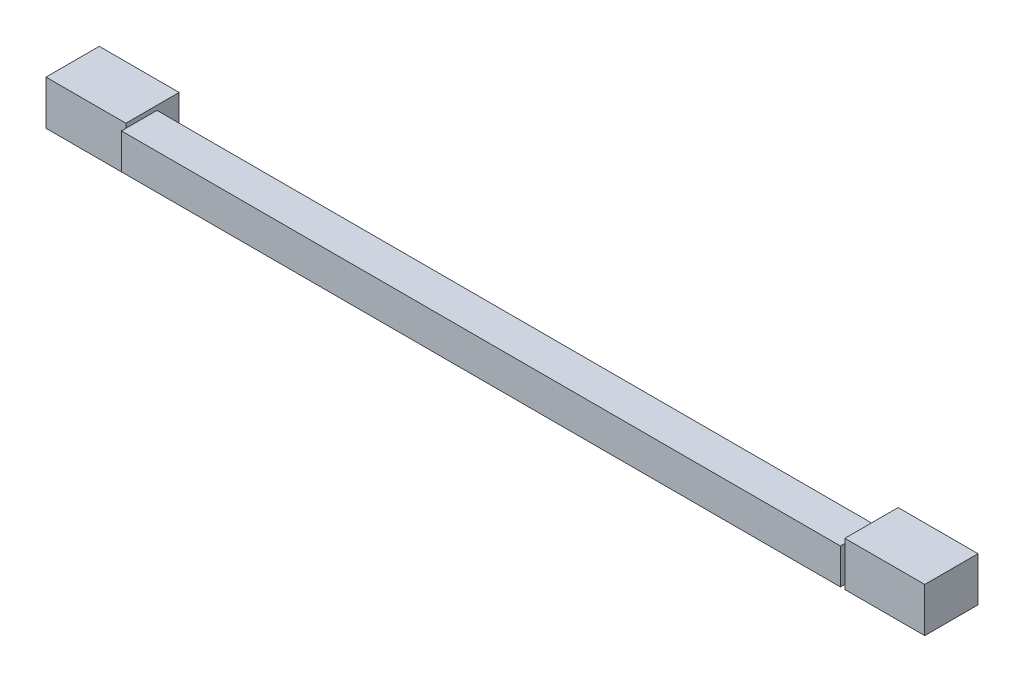
ISO-10303-21;
HEADER;
FILE_DESCRIPTION(('STEP AP214'),'2;1');
FILE_NAME('part.step','',(''),(''),'','','');
FILE_SCHEMA(('AUTOMOTIVE_DESIGN { 1 0 10303 214 1 1 1 1 }'));
ENDSEC;
DATA;
#1=APPLICATION_CONTEXT('core data for automotive mechanical design processes');
#2=APPLICATION_PROTOCOL_DEFINITION('international standard','automotive_design',2000,#1);
#3=PRODUCT_CONTEXT('',#1,'mechanical');
#4=PRODUCT('Part','Part','',(#3));
#5=PRODUCT_RELATED_PRODUCT_CATEGORY('part','',(#4));
#6=PRODUCT_DEFINITION_FORMATION('','',#4);
#7=PRODUCT_DEFINITION_CONTEXT('part definition',#1,'design');
#8=PRODUCT_DEFINITION('design','',#6,#7);
#9=PRODUCT_DEFINITION_SHAPE('','',#8);
#10=(LENGTH_UNIT() NAMED_UNIT(*) SI_UNIT(.MILLI.,.METRE.));
#11=(NAMED_UNIT(*) PLANE_ANGLE_UNIT() SI_UNIT($,.RADIAN.));
#12=(NAMED_UNIT(*) SI_UNIT($,.STERADIAN.) SOLID_ANGLE_UNIT());
#13=UNCERTAINTY_MEASURE_WITH_UNIT(LENGTH_MEASURE(1.E-05),#10,'distance_accuracy_value','');
#14=(GEOMETRIC_REPRESENTATION_CONTEXT(3) GLOBAL_UNCERTAINTY_ASSIGNED_CONTEXT((#13)) GLOBAL_UNIT_ASSIGNED_CONTEXT((#10,
#11,#12)) REPRESENTATION_CONTEXT('',''));
#15=CARTESIAN_POINT('',(0.,0.,0.));
#16=DIRECTION('',(0.,0.,1.));
#17=DIRECTION('',(1.,0.,0.));
#18=AXIS2_PLACEMENT_3D('',#15,#16,#17);
#19=CARTESIAN_POINT('',(0.,0.,13.));
#20=DIRECTION('',(0.,0.,1.));
#21=DIRECTION('',(1.,0.,0.));
#22=AXIS2_PLACEMENT_3D('',#19,#20,#21);
#23=PLANE('',#22);
#24=DIRECTION('',(-1.,0.,0.));
#25=VECTOR('',#24,1.);
#26=CARTESIAN_POINT('',(0.,-4.,13.));
#27=LINE('',#26,#25);
#28=CARTESIAN_POINT('',(81.,-4.,13.));
#29=VERTEX_POINT('',#28);
#30=CARTESIAN_POINT('',(-81.,-4.,13.));
#31=VERTEX_POINT('',#30);
#32=EDGE_CURVE('P0_E10',#29,#31,#27,.T.);
#33=ORIENTED_EDGE('',*,*,#32,.F.);
#34=DIRECTION('',(0.,-1.,0.));
#35=VECTOR('',#34,1.);
#36=CARTESIAN_POINT('',(81.,0.,13.));
#37=LINE('',#36,#35);
#38=CARTESIAN_POINT('',(81.,4.,13.));
#39=VERTEX_POINT('',#38);
#40=EDGE_CURVE('P0_E60',#39,#29,#37,.T.);
#41=ORIENTED_EDGE('',*,*,#40,.F.);
#42=DIRECTION('',(1.,0.,0.));
#43=VECTOR('',#42,1.);
#44=CARTESIAN_POINT('',(0.,4.,13.));
#45=LINE('',#44,#43);
#46=CARTESIAN_POINT('',(-81.,4.,13.));
#47=VERTEX_POINT('',#46);
#48=EDGE_CURVE('P0_E86',#47,#39,#45,.T.);
#49=ORIENTED_EDGE('',*,*,#48,.F.);
#50=DIRECTION('',(0.,1.,0.));
#51=VECTOR('',#50,1.);
#52=CARTESIAN_POINT('',(-81.,0.,13.));
#53=LINE('',#52,#51);
#54=EDGE_CURVE('P0_E23',#31,#47,#53,.T.);
#55=ORIENTED_EDGE('',*,*,#54,.F.);
#56=EDGE_LOOP('',(#33,#41,#49,#55));
#57=FACE_BOUND('',#56,.T.);
#58=ADVANCED_FACE('P0_F16',(#57),#23,.T.);
#59=CARTESIAN_POINT('',(0.,-4.,5.));
#60=DIRECTION('',(0.,-1.,0.));
#61=DIRECTION('',(0.,0.,-1.));
#62=AXIS2_PLACEMENT_3D('',#59,#60,#61);
#63=PLANE('',#62);
#64=DIRECTION('',(0.,0.,1.));
#65=VECTOR('',#64,1.);
#66=CARTESIAN_POINT('',(81.,-4.,5.));
#67=LINE('',#66,#65);
#68=CARTESIAN_POINT('',(81.,-4.,5.));
#69=VERTEX_POINT('',#68);
#70=EDGE_CURVE('P0_E53',#69,#29,#67,.T.);
#71=ORIENTED_EDGE('',*,*,#70,.T.);
#72=ORIENTED_EDGE('',*,*,#32,.T.);
#73=DIRECTION('',(0.,0.,1.));
#74=VECTOR('',#73,1.);
#75=CARTESIAN_POINT('',(-81.,-4.,5.));
#76=LINE('',#75,#74);
#77=CARTESIAN_POINT('',(-81.,-4.,5.));
#78=VERTEX_POINT('',#77);
#79=EDGE_CURVE('P0_E66',#78,#31,#76,.T.);
#80=ORIENTED_EDGE('',*,*,#79,.F.);
#81=DIRECTION('',(1.,0.,0.));
#82=VECTOR('',#81,1.);
#83=CARTESIAN_POINT('',(0.,-4.,5.));
#84=LINE('',#83,#82);
#85=EDGE_CURVE('P0_E64',#78,#69,#84,.T.);
#86=ORIENTED_EDGE('',*,*,#85,.T.);
#87=EDGE_LOOP('',(#71,#72,#80,#86));
#88=FACE_BOUND('',#87,.T.);
#89=ADVANCED_FACE('P0_F65',(#88),#63,.T.);
#90=CARTESIAN_POINT('',(-81.,0.,5.));
#91=DIRECTION('',(-1.,0.,0.));
#92=DIRECTION('',(0.,0.,1.));
#93=AXIS2_PLACEMENT_3D('',#90,#91,#92);
#94=PLANE('',#93);
#95=ORIENTED_EDGE('',*,*,#79,.T.);
#96=ORIENTED_EDGE('',*,*,#54,.T.);
#97=DIRECTION('',(0.,0.,1.));
#98=VECTOR('',#97,1.);
#99=CARTESIAN_POINT('',(-81.,4.,5.));
#100=LINE('',#99,#98);
#101=CARTESIAN_POINT('',(-81.,4.,5.));
#102=VERTEX_POINT('',#101);
#103=EDGE_CURVE('P0_E81',#102,#47,#100,.T.);
#104=ORIENTED_EDGE('',*,*,#103,.F.);
#105=DIRECTION('',(0.,-1.,0.));
#106=VECTOR('',#105,1.);
#107=CARTESIAN_POINT('',(-81.,0.,5.));
#108=LINE('',#107,#106);
#109=EDGE_CURVE('P0_E70',#102,#78,#108,.T.);
#110=ORIENTED_EDGE('',*,*,#109,.T.);
#111=EDGE_LOOP('',(#95,#96,#104,#110));
#112=FACE_BOUND('',#111,.T.);
#113=ADVANCED_FACE('P0_F90',(#112),#94,.T.);
#114=CARTESIAN_POINT('',(0.,4.,5.));
#115=DIRECTION('',(0.,1.,0.));
#116=DIRECTION('',(0.,0.,1.));
#117=AXIS2_PLACEMENT_3D('',#114,#115,#116);
#118=PLANE('',#117);
#119=ORIENTED_EDGE('',*,*,#103,.T.);
#120=ORIENTED_EDGE('',*,*,#48,.T.);
#121=DIRECTION('',(0.,0.,1.));
#122=VECTOR('',#121,1.);
#123=CARTESIAN_POINT('',(81.,4.,5.));
#124=LINE('',#123,#122);
#125=CARTESIAN_POINT('',(81.,4.,5.));
#126=VERTEX_POINT('',#125);
#127=EDGE_CURVE('P0_E61',#126,#39,#124,.T.);
#128=ORIENTED_EDGE('',*,*,#127,.F.);
#129=DIRECTION('',(-1.,0.,0.));
#130=VECTOR('',#129,1.);
#131=CARTESIAN_POINT('',(0.,4.,5.));
#132=LINE('',#131,#130);
#133=EDGE_CURVE('P0_E75',#126,#102,#132,.T.);
#134=ORIENTED_EDGE('',*,*,#133,.T.);
#135=EDGE_LOOP('',(#119,#120,#128,#134));
#136=FACE_BOUND('',#135,.T.);
#137=ADVANCED_FACE('P0_F88',(#136),#118,.T.);
#138=CARTESIAN_POINT('',(0.,0.,5.));
#139=DIRECTION('',(0.,0.,-1.));
#140=DIRECTION('',(-1.,0.,0.));
#141=AXIS2_PLACEMENT_3D('',#138,#139,#140);
#142=PLANE('',#141);
#143=DIRECTION('',(0.,1.,0.));
#144=VECTOR('',#143,1.);
#145=CARTESIAN_POINT('',(81.,0.,5.));
#146=LINE('',#145,#144);
#147=EDGE_CURVE('P0_E58',#69,#126,#146,.T.);
#148=ORIENTED_EDGE('',*,*,#147,.F.);
#149=ORIENTED_EDGE('',*,*,#85,.F.);
#150=ORIENTED_EDGE('',*,*,#109,.F.);
#151=ORIENTED_EDGE('',*,*,#133,.F.);
#152=EDGE_LOOP('',(#148,#149,#150,#151));
#153=FACE_BOUND('',#152,.T.);
#154=ADVANCED_FACE('P0_F73',(#153),#142,.T.);
#155=CARTESIAN_POINT('',(81.,0.,5.));
#156=DIRECTION('',(1.,0.,0.));
#157=DIRECTION('',(0.,0.,-1.));
#158=AXIS2_PLACEMENT_3D('',#155,#156,#157);
#159=PLANE('',#158);
#160=ORIENTED_EDGE('',*,*,#147,.T.);
#161=ORIENTED_EDGE('',*,*,#127,.T.);
#162=ORIENTED_EDGE('',*,*,#40,.T.);
#163=ORIENTED_EDGE('',*,*,#70,.F.);
#164=EDGE_LOOP('',(#160,#161,#162,#163));
#165=FACE_BOUND('',#164,.T.);
#166=ADVANCED_FACE('P0_F55',(#165),#159,.T.);
#167=CLOSED_SHELL('',(#58,#89,#113,#137,#154,#166));
#168=MANIFOLD_SOLID_BREP('P0_B1',#167);
#169=CARTESIAN_POINT('',(-90.,0.,12.));
#170=DIRECTION('',(0.,0.,1.));
#171=DIRECTION('',(1.,0.,0.));
#172=AXIS2_PLACEMENT_3D('',#169,#170,#171);
#173=PLANE('',#172);
#174=DIRECTION('',(-1.,0.,0.));
#175=VECTOR('',#174,1.);
#176=CARTESIAN_POINT('',(-90.,-5.,12.));
#177=LINE('',#176,#175);
#178=CARTESIAN_POINT('',(-81.,-5.,12.));
#179=VERTEX_POINT('',#178);
#180=CARTESIAN_POINT('',(-99.,-5.,12.));
#181=VERTEX_POINT('',#180);
#182=EDGE_CURVE('P1_E11',#179,#181,#177,.T.);
#183=ORIENTED_EDGE('',*,*,#182,.F.);
#184=DIRECTION('',(0.,-1.,0.));
#185=VECTOR('',#184,1.);
#186=CARTESIAN_POINT('',(-81.,0.,12.));
#187=LINE('',#186,#185);
#188=CARTESIAN_POINT('',(-81.,5.,12.));
#189=VERTEX_POINT('',#188);
#190=EDGE_CURVE('P1_E61',#189,#179,#187,.T.);
#191=ORIENTED_EDGE('',*,*,#190,.F.);
#192=DIRECTION('',(1.,0.,0.));
#193=VECTOR('',#192,1.);
#194=CARTESIAN_POINT('',(-90.,5.,12.));
#195=LINE('',#194,#193);
#196=CARTESIAN_POINT('',(-99.,5.,12.));
#197=VERTEX_POINT('',#196);
#198=EDGE_CURVE('P1_E87',#197,#189,#195,.T.);
#199=ORIENTED_EDGE('',*,*,#198,.F.);
#200=DIRECTION('',(0.,1.,0.));
#201=VECTOR('',#200,1.);
#202=CARTESIAN_POINT('',(-99.,0.,12.));
#203=LINE('',#202,#201);
#204=EDGE_CURVE('P1_E24',#181,#197,#203,.T.);
#205=ORIENTED_EDGE('',*,*,#204,.F.);
#206=EDGE_LOOP('',(#183,#191,#199,#205));
#207=FACE_BOUND('',#206,.T.);
#208=ADVANCED_FACE('P1_F17',(#207),#173,.T.);
#209=CARTESIAN_POINT('',(-90.,-5.,0.));
#210=DIRECTION('',(0.,-1.,0.));
#211=DIRECTION('',(0.,0.,-1.));
#212=AXIS2_PLACEMENT_3D('',#209,#210,#211);
#213=PLANE('',#212);
#214=DIRECTION('',(0.,0.,1.));
#215=VECTOR('',#214,1.);
#216=CARTESIAN_POINT('',(-81.,-5.,0.));
#217=LINE('',#216,#215);
#218=CARTESIAN_POINT('',(-81.,-5.,0.));
#219=VERTEX_POINT('',#218);
#220=EDGE_CURVE('P1_E54',#219,#179,#217,.T.);
#221=ORIENTED_EDGE('',*,*,#220,.T.);
#222=ORIENTED_EDGE('',*,*,#182,.T.);
#223=DIRECTION('',(0.,0.,1.));
#224=VECTOR('',#223,1.);
#225=CARTESIAN_POINT('',(-99.,-5.,0.));
#226=LINE('',#225,#224);
#227=CARTESIAN_POINT('',(-99.,-5.,0.));
#228=VERTEX_POINT('',#227);
#229=EDGE_CURVE('P1_E67',#228,#181,#226,.T.);
#230=ORIENTED_EDGE('',*,*,#229,.F.);
#231=DIRECTION('',(1.,0.,0.));
#232=VECTOR('',#231,1.);
#233=CARTESIAN_POINT('',(-90.,-5.,0.));
#234=LINE('',#233,#232);
#235=EDGE_CURVE('P1_E65',#228,#219,#234,.T.);
#236=ORIENTED_EDGE('',*,*,#235,.T.);
#237=EDGE_LOOP('',(#221,#222,#230,#236));
#238=FACE_BOUND('',#237,.T.);
#239=ADVANCED_FACE('P1_F66',(#238),#213,.T.);
#240=CARTESIAN_POINT('',(-99.,0.,0.));
#241=DIRECTION('',(-1.,0.,0.));
#242=DIRECTION('',(0.,0.,1.));
#243=AXIS2_PLACEMENT_3D('',#240,#241,#242);
#244=PLANE('',#243);
#245=ORIENTED_EDGE('',*,*,#229,.T.);
#246=ORIENTED_EDGE('',*,*,#204,.T.);
#247=DIRECTION('',(0.,0.,1.));
#248=VECTOR('',#247,1.);
#249=CARTESIAN_POINT('',(-99.,5.,0.));
#250=LINE('',#249,#248);
#251=CARTESIAN_POINT('',(-99.,5.,0.));
#252=VERTEX_POINT('',#251);
#253=EDGE_CURVE('P1_E82',#252,#197,#250,.T.);
#254=ORIENTED_EDGE('',*,*,#253,.F.);
#255=DIRECTION('',(0.,-1.,0.));
#256=VECTOR('',#255,1.);
#257=CARTESIAN_POINT('',(-99.,0.,0.));
#258=LINE('',#257,#256);
#259=EDGE_CURVE('P1_E71',#252,#228,#258,.T.);
#260=ORIENTED_EDGE('',*,*,#259,.T.);
#261=EDGE_LOOP('',(#245,#246,#254,#260));
#262=FACE_BOUND('',#261,.T.);
#263=ADVANCED_FACE('P1_F91',(#262),#244,.T.);
#264=CARTESIAN_POINT('',(-90.,5.,0.));
#265=DIRECTION('',(0.,1.,0.));
#266=DIRECTION('',(0.,0.,1.));
#267=AXIS2_PLACEMENT_3D('',#264,#265,#266);
#268=PLANE('',#267);
#269=ORIENTED_EDGE('',*,*,#253,.T.);
#270=ORIENTED_EDGE('',*,*,#198,.T.);
#271=DIRECTION('',(0.,0.,1.));
#272=VECTOR('',#271,1.);
#273=CARTESIAN_POINT('',(-81.,5.,0.));
#274=LINE('',#273,#272);
#275=CARTESIAN_POINT('',(-81.,5.,0.));
#276=VERTEX_POINT('',#275);
#277=EDGE_CURVE('P1_E62',#276,#189,#274,.T.);
#278=ORIENTED_EDGE('',*,*,#277,.F.);
#279=DIRECTION('',(-1.,0.,0.));
#280=VECTOR('',#279,1.);
#281=CARTESIAN_POINT('',(-90.,5.,0.));
#282=LINE('',#281,#280);
#283=EDGE_CURVE('P1_E76',#276,#252,#282,.T.);
#284=ORIENTED_EDGE('',*,*,#283,.T.);
#285=EDGE_LOOP('',(#269,#270,#278,#284));
#286=FACE_BOUND('',#285,.T.);
#287=ADVANCED_FACE('P1_F89',(#286),#268,.T.);
#288=CARTESIAN_POINT('',(-90.,0.,0.));
#289=DIRECTION('',(0.,0.,-1.));
#290=DIRECTION('',(-1.,0.,0.));
#291=AXIS2_PLACEMENT_3D('',#288,#289,#290);
#292=PLANE('',#291);
#293=DIRECTION('',(0.,1.,0.));
#294=VECTOR('',#293,1.);
#295=CARTESIAN_POINT('',(-81.,0.,0.));
#296=LINE('',#295,#294);
#297=EDGE_CURVE('P1_E59',#219,#276,#296,.T.);
#298=ORIENTED_EDGE('',*,*,#297,.F.);
#299=ORIENTED_EDGE('',*,*,#235,.F.);
#300=ORIENTED_EDGE('',*,*,#259,.F.);
#301=ORIENTED_EDGE('',*,*,#283,.F.);
#302=EDGE_LOOP('',(#298,#299,#300,#301));
#303=FACE_BOUND('',#302,.T.);
#304=ADVANCED_FACE('P1_F74',(#303),#292,.T.);
#305=CARTESIAN_POINT('',(-81.,0.,0.));
#306=DIRECTION('',(1.,0.,0.));
#307=DIRECTION('',(0.,0.,-1.));
#308=AXIS2_PLACEMENT_3D('',#305,#306,#307);
#309=PLANE('',#308);
#310=ORIENTED_EDGE('',*,*,#297,.T.);
#311=ORIENTED_EDGE('',*,*,#277,.T.);
#312=ORIENTED_EDGE('',*,*,#190,.T.);
#313=ORIENTED_EDGE('',*,*,#220,.F.);
#314=EDGE_LOOP('',(#310,#311,#312,#313));
#315=FACE_BOUND('',#314,.T.);
#316=ADVANCED_FACE('P1_F56',(#315),#309,.T.);
#317=CLOSED_SHELL('',(#208,#239,#263,#287,#304,#316));
#318=MANIFOLD_SOLID_BREP('P1_B1',#317);
#319=CARTESIAN_POINT('',(90.,0.,12.));
#320=DIRECTION('',(0.,0.,1.));
#321=DIRECTION('',(1.,0.,0.));
#322=AXIS2_PLACEMENT_3D('',#319,#320,#321);
#323=PLANE('',#322);
#324=DIRECTION('',(-1.,0.,0.));
#325=VECTOR('',#324,1.);
#326=CARTESIAN_POINT('',(90.,-5.,12.));
#327=LINE('',#326,#325);
#328=CARTESIAN_POINT('',(99.,-5.,12.));
#329=VERTEX_POINT('',#328);
#330=CARTESIAN_POINT('',(81.,-5.,12.));
#331=VERTEX_POINT('',#330);
#332=EDGE_CURVE('P2_E10',#329,#331,#327,.T.);
#333=ORIENTED_EDGE('',*,*,#332,.F.);
#334=DIRECTION('',(0.,-1.,0.));
#335=VECTOR('',#334,1.);
#336=CARTESIAN_POINT('',(99.,0.,12.));
#337=LINE('',#336,#335);
#338=CARTESIAN_POINT('',(99.,5.,12.));
#339=VERTEX_POINT('',#338);
#340=EDGE_CURVE('P2_E60',#339,#329,#337,.T.);
#341=ORIENTED_EDGE('',*,*,#340,.F.);
#342=DIRECTION('',(1.,0.,0.));
#343=VECTOR('',#342,1.);
#344=CARTESIAN_POINT('',(90.,5.,12.));
#345=LINE('',#344,#343);
#346=CARTESIAN_POINT('',(81.,5.,12.));
#347=VERTEX_POINT('',#346);
#348=EDGE_CURVE('P2_E86',#347,#339,#345,.T.);
#349=ORIENTED_EDGE('',*,*,#348,.F.);
#350=DIRECTION('',(0.,1.,0.));
#351=VECTOR('',#350,1.);
#352=CARTESIAN_POINT('',(81.,0.,12.));
#353=LINE('',#352,#351);
#354=EDGE_CURVE('P2_E23',#331,#347,#353,.T.);
#355=ORIENTED_EDGE('',*,*,#354,.F.);
#356=EDGE_LOOP('',(#333,#341,#349,#355));
#357=FACE_BOUND('',#356,.T.);
#358=ADVANCED_FACE('P2_F16',(#357),#323,.T.);
#359=CARTESIAN_POINT('',(90.,-5.,0.));
#360=DIRECTION('',(0.,-1.,0.));
#361=DIRECTION('',(0.,0.,-1.));
#362=AXIS2_PLACEMENT_3D('',#359,#360,#361);
#363=PLANE('',#362);
#364=DIRECTION('',(0.,0.,1.));
#365=VECTOR('',#364,1.);
#366=CARTESIAN_POINT('',(99.,-5.,0.));
#367=LINE('',#366,#365);
#368=CARTESIAN_POINT('',(99.,-5.,0.));
#369=VERTEX_POINT('',#368);
#370=EDGE_CURVE('P2_E53',#369,#329,#367,.T.);
#371=ORIENTED_EDGE('',*,*,#370,.T.);
#372=ORIENTED_EDGE('',*,*,#332,.T.);
#373=DIRECTION('',(0.,0.,1.));
#374=VECTOR('',#373,1.);
#375=CARTESIAN_POINT('',(81.,-5.,0.));
#376=LINE('',#375,#374);
#377=CARTESIAN_POINT('',(81.,-5.,0.));
#378=VERTEX_POINT('',#377);
#379=EDGE_CURVE('P2_E66',#378,#331,#376,.T.);
#380=ORIENTED_EDGE('',*,*,#379,.F.);
#381=DIRECTION('',(1.,0.,0.));
#382=VECTOR('',#381,1.);
#383=CARTESIAN_POINT('',(90.,-5.,0.));
#384=LINE('',#383,#382);
#385=EDGE_CURVE('P2_E64',#378,#369,#384,.T.);
#386=ORIENTED_EDGE('',*,*,#385,.T.);
#387=EDGE_LOOP('',(#371,#372,#380,#386));
#388=FACE_BOUND('',#387,.T.);
#389=ADVANCED_FACE('P2_F65',(#388),#363,.T.);
#390=CARTESIAN_POINT('',(81.,0.,0.));
#391=DIRECTION('',(-1.,0.,0.));
#392=DIRECTION('',(0.,0.,1.));
#393=AXIS2_PLACEMENT_3D('',#390,#391,#392);
#394=PLANE('',#393);
#395=ORIENTED_EDGE('',*,*,#379,.T.);
#396=ORIENTED_EDGE('',*,*,#354,.T.);
#397=DIRECTION('',(0.,0.,1.));
#398=VECTOR('',#397,1.);
#399=CARTESIAN_POINT('',(81.,5.,0.));
#400=LINE('',#399,#398);
#401=CARTESIAN_POINT('',(81.,5.,0.));
#402=VERTEX_POINT('',#401);
#403=EDGE_CURVE('P2_E81',#402,#347,#400,.T.);
#404=ORIENTED_EDGE('',*,*,#403,.F.);
#405=DIRECTION('',(0.,-1.,0.));
#406=VECTOR('',#405,1.);
#407=CARTESIAN_POINT('',(81.,0.,0.));
#408=LINE('',#407,#406);
#409=EDGE_CURVE('P2_E70',#402,#378,#408,.T.);
#410=ORIENTED_EDGE('',*,*,#409,.T.);
#411=EDGE_LOOP('',(#395,#396,#404,#410));
#412=FACE_BOUND('',#411,.T.);
#413=ADVANCED_FACE('P2_F90',(#412),#394,.T.);
#414=CARTESIAN_POINT('',(90.,5.,0.));
#415=DIRECTION('',(0.,1.,0.));
#416=DIRECTION('',(0.,0.,1.));
#417=AXIS2_PLACEMENT_3D('',#414,#415,#416);
#418=PLANE('',#417);
#419=ORIENTED_EDGE('',*,*,#403,.T.);
#420=ORIENTED_EDGE('',*,*,#348,.T.);
#421=DIRECTION('',(0.,0.,1.));
#422=VECTOR('',#421,1.);
#423=CARTESIAN_POINT('',(99.,5.,0.));
#424=LINE('',#423,#422);
#425=CARTESIAN_POINT('',(99.,5.,0.));
#426=VERTEX_POINT('',#425);
#427=EDGE_CURVE('P2_E61',#426,#339,#424,.T.);
#428=ORIENTED_EDGE('',*,*,#427,.F.);
#429=DIRECTION('',(-1.,0.,0.));
#430=VECTOR('',#429,1.);
#431=CARTESIAN_POINT('',(90.,5.,0.));
#432=LINE('',#431,#430);
#433=EDGE_CURVE('P2_E75',#426,#402,#432,.T.);
#434=ORIENTED_EDGE('',*,*,#433,.T.);
#435=EDGE_LOOP('',(#419,#420,#428,#434));
#436=FACE_BOUND('',#435,.T.);
#437=ADVANCED_FACE('P2_F88',(#436),#418,.T.);
#438=CARTESIAN_POINT('',(90.,0.,0.));
#439=DIRECTION('',(0.,0.,-1.));
#440=DIRECTION('',(-1.,0.,0.));
#441=AXIS2_PLACEMENT_3D('',#438,#439,#440);
#442=PLANE('',#441);
#443=DIRECTION('',(0.,1.,0.));
#444=VECTOR('',#443,1.);
#445=CARTESIAN_POINT('',(99.,0.,0.));
#446=LINE('',#445,#444);
#447=EDGE_CURVE('P2_E58',#369,#426,#446,.T.);
#448=ORIENTED_EDGE('',*,*,#447,.F.);
#449=ORIENTED_EDGE('',*,*,#385,.F.);
#450=ORIENTED_EDGE('',*,*,#409,.F.);
#451=ORIENTED_EDGE('',*,*,#433,.F.);
#452=EDGE_LOOP('',(#448,#449,#450,#451));
#453=FACE_BOUND('',#452,.T.);
#454=ADVANCED_FACE('P2_F73',(#453),#442,.T.);
#455=CARTESIAN_POINT('',(99.,0.,0.));
#456=DIRECTION('',(1.,0.,0.));
#457=DIRECTION('',(0.,0.,-1.));
#458=AXIS2_PLACEMENT_3D('',#455,#456,#457);
#459=PLANE('',#458);
#460=ORIENTED_EDGE('',*,*,#447,.T.);
#461=ORIENTED_EDGE('',*,*,#427,.T.);
#462=ORIENTED_EDGE('',*,*,#340,.T.);
#463=ORIENTED_EDGE('',*,*,#370,.F.);
#464=EDGE_LOOP('',(#460,#461,#462,#463));
#465=FACE_BOUND('',#464,.T.);
#466=ADVANCED_FACE('P2_F55',(#465),#459,.T.);
#467=CLOSED_SHELL('',(#358,#389,#413,#437,#454,#466));
#468=MANIFOLD_SOLID_BREP('P2_B1',#467);
#469=ADVANCED_BREP_SHAPE_REPRESENTATION('',(#18,#168,#318,#468),#14);
#470=SHAPE_DEFINITION_REPRESENTATION(#9,#469);
ENDSEC;
END-ISO-10303-21;
